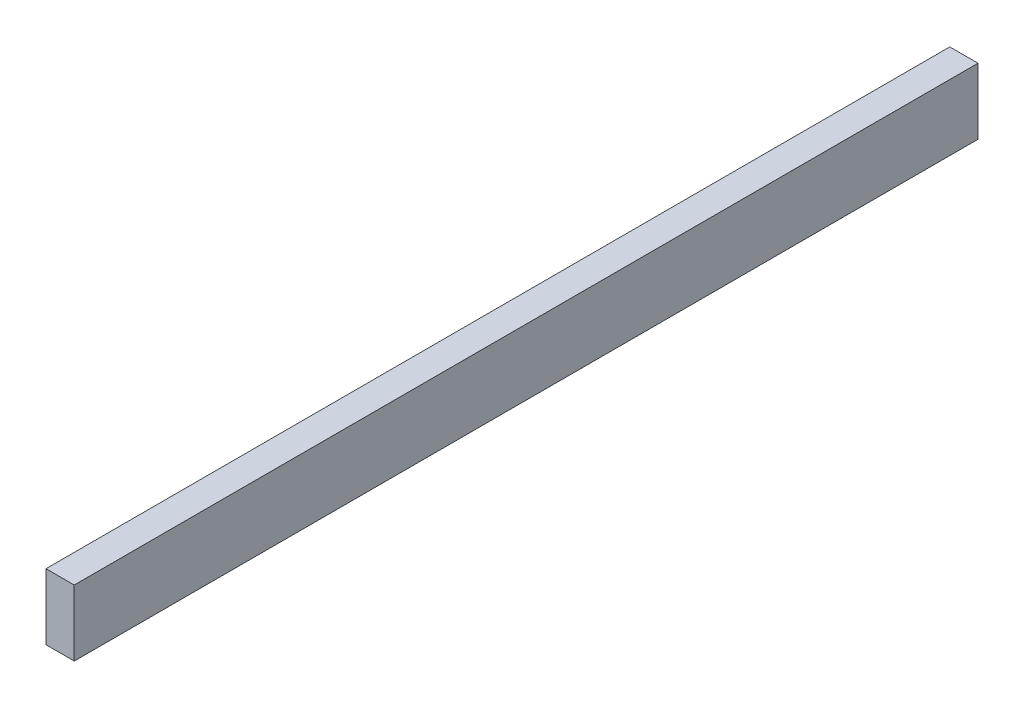
ISO-10303-21;
HEADER;
FILE_DESCRIPTION(('STEP AP214'),'2;1');
FILE_NAME('part.step','',(''),(''),'','','');
FILE_SCHEMA(('AUTOMOTIVE_DESIGN { 1 0 10303 214 1 1 1 1 }'));
ENDSEC;
DATA;
#1=APPLICATION_CONTEXT('core data for automotive mechanical design processes');
#2=APPLICATION_PROTOCOL_DEFINITION('international standard','automotive_design',2000,#1);
#3=PRODUCT_CONTEXT('',#1,'mechanical');
#4=PRODUCT('Part','Part','',(#3));
#5=PRODUCT_RELATED_PRODUCT_CATEGORY('part','',(#4));
#6=PRODUCT_DEFINITION_FORMATION('','',#4);
#7=PRODUCT_DEFINITION_CONTEXT('part definition',#1,'design');
#8=PRODUCT_DEFINITION('design','',#6,#7);
#9=PRODUCT_DEFINITION_SHAPE('','',#8);
#10=(LENGTH_UNIT() NAMED_UNIT(*) SI_UNIT(.MILLI.,.METRE.));
#11=(NAMED_UNIT(*) PLANE_ANGLE_UNIT() SI_UNIT($,.RADIAN.));
#12=(NAMED_UNIT(*) SI_UNIT($,.STERADIAN.) SOLID_ANGLE_UNIT());
#13=UNCERTAINTY_MEASURE_WITH_UNIT(LENGTH_MEASURE(1.E-05),#10,'distance_accuracy_value','');
#14=(GEOMETRIC_REPRESENTATION_CONTEXT(3) GLOBAL_UNCERTAINTY_ASSIGNED_CONTEXT((#13)) GLOBAL_UNIT_ASSIGNED_CONTEXT((#10,
#11,#12)) REPRESENTATION_CONTEXT('',''));
#15=CARTESIAN_POINT('',(0.,0.,0.));
#16=DIRECTION('',(0.,0.,1.));
#17=DIRECTION('',(1.,0.,0.));
#18=AXIS2_PLACEMENT_3D('',#15,#16,#17);
#19=CARTESIAN_POINT('',(19.05,0.,0.));
#20=DIRECTION('',(0.,0.,-1.));
#21=DIRECTION('',(-1.,0.,0.));
#22=AXIS2_PLACEMENT_3D('',#19,#20,#21);
#23=PLANE('',#22);
#24=DIRECTION('',(0.,-1.,0.));
#25=VECTOR('',#24,1.);
#26=CARTESIAN_POINT('',(0.,0.,0.));
#27=LINE('',#26,#25);
#28=CARTESIAN_POINT('',(0.,44.45,0.));
#29=VERTEX_POINT('',#28);
#30=CARTESIAN_POINT('',(0.,0.,0.));
#31=VERTEX_POINT('',#30);
#32=EDGE_CURVE('E96',#29,#31,#27,.T.);
#33=ORIENTED_EDGE('',*,*,#32,.T.);
#34=DIRECTION('',(-1.,0.,0.));
#35=VECTOR('',#34,1.);
#36=CARTESIAN_POINT('',(19.05,0.,0.));
#37=LINE('',#36,#35);
#38=CARTESIAN_POINT('',(19.05,0.,0.));
#39=VERTEX_POINT('',#38);
#40=EDGE_CURVE('E11',#39,#31,#37,.T.);
#41=ORIENTED_EDGE('',*,*,#40,.F.);
#42=DIRECTION('',(0.,-1.,0.));
#43=VECTOR('',#42,1.);
#44=CARTESIAN_POINT('',(19.05,0.,0.));
#45=LINE('',#44,#43);
#46=CARTESIAN_POINT('',(19.05,44.45,0.));
#47=VERTEX_POINT('',#46);
#48=EDGE_CURVE('E84',#47,#39,#45,.T.);
#49=ORIENTED_EDGE('',*,*,#48,.F.);
#50=DIRECTION('',(-1.,0.,0.));
#51=VECTOR('',#50,1.);
#52=CARTESIAN_POINT('',(19.05,44.45,0.));
#53=LINE('',#52,#51);
#54=EDGE_CURVE('E92',#47,#29,#53,.T.);
#55=ORIENTED_EDGE('',*,*,#54,.T.);
#56=EDGE_LOOP('',(#33,#41,#49,#55));
#57=FACE_BOUND('',#56,.T.);
#58=ADVANCED_FACE('F33',(#57),#23,.F.);
#59=CARTESIAN_POINT('',(19.05,0.,0.));
#60=DIRECTION('',(0.,1.,0.));
#61=DIRECTION('',(0.,0.,1.));
#62=AXIS2_PLACEMENT_3D('',#59,#60,#61);
#63=PLANE('',#62);
#64=DIRECTION('',(0.,0.,-1.));
#65=VECTOR('',#64,1.);
#66=CARTESIAN_POINT('',(0.,0.,0.));
#67=LINE('',#66,#65);
#68=CARTESIAN_POINT('',(0.,0.,-609.6));
#69=VERTEX_POINT('',#68);
#70=EDGE_CURVE('E88',#31,#69,#67,.T.);
#71=ORIENTED_EDGE('',*,*,#70,.T.);
#72=DIRECTION('',(-1.,0.,0.));
#73=VECTOR('',#72,1.);
#74=CARTESIAN_POINT('',(19.05,0.,-609.6));
#75=LINE('',#74,#73);
#76=CARTESIAN_POINT('',(19.05,0.,-609.6));
#77=VERTEX_POINT('',#76);
#78=EDGE_CURVE('E41',#77,#69,#75,.T.);
#79=ORIENTED_EDGE('',*,*,#78,.F.);
#80=DIRECTION('',(0.,0.,-1.));
#81=VECTOR('',#80,1.);
#82=CARTESIAN_POINT('',(19.05,0.,0.));
#83=LINE('',#82,#81);
#84=EDGE_CURVE('E79',#39,#77,#83,.T.);
#85=ORIENTED_EDGE('',*,*,#84,.F.);
#86=ORIENTED_EDGE('',*,*,#40,.T.);
#87=EDGE_LOOP('',(#71,#79,#85,#86));
#88=FACE_BOUND('',#87,.T.);
#89=ADVANCED_FACE('F87',(#88),#63,.F.);
#90=CARTESIAN_POINT('',(19.05,0.,-609.6));
#91=DIRECTION('',(0.,0.,1.));
#92=DIRECTION('',(1.,0.,0.));
#93=AXIS2_PLACEMENT_3D('',#90,#91,#92);
#94=PLANE('',#93);
#95=DIRECTION('',(0.,1.,0.));
#96=VECTOR('',#95,1.);
#97=CARTESIAN_POINT('',(0.,0.,-609.6));
#98=LINE('',#97,#96);
#99=CARTESIAN_POINT('',(0.,44.45,-609.6));
#100=VERTEX_POINT('',#99);
#101=EDGE_CURVE('E66',#69,#100,#98,.T.);
#102=ORIENTED_EDGE('',*,*,#101,.T.);
#103=DIRECTION('',(-1.,0.,0.));
#104=VECTOR('',#103,1.);
#105=CARTESIAN_POINT('',(19.05,44.45,-609.6));
#106=LINE('',#105,#104);
#107=CARTESIAN_POINT('',(19.05,44.45,-609.6));
#108=VERTEX_POINT('',#107);
#109=EDGE_CURVE('E89',#108,#100,#106,.T.);
#110=ORIENTED_EDGE('',*,*,#109,.F.);
#111=DIRECTION('',(0.,1.,0.));
#112=VECTOR('',#111,1.);
#113=CARTESIAN_POINT('',(19.05,0.,-609.6));
#114=LINE('',#113,#112);
#115=EDGE_CURVE('E82',#77,#108,#114,.T.);
#116=ORIENTED_EDGE('',*,*,#115,.F.);
#117=ORIENTED_EDGE('',*,*,#78,.T.);
#118=EDGE_LOOP('',(#102,#110,#116,#117));
#119=FACE_BOUND('',#118,.T.);
#120=ADVANCED_FACE('F90',(#119),#94,.F.);
#121=CARTESIAN_POINT('',(19.05,44.45,0.));
#122=DIRECTION('',(0.,-1.,0.));
#123=DIRECTION('',(0.,0.,-1.));
#124=AXIS2_PLACEMENT_3D('',#121,#122,#123);
#125=PLANE('',#124);
#126=DIRECTION('',(0.,0.,1.));
#127=VECTOR('',#126,1.);
#128=CARTESIAN_POINT('',(0.,44.45,0.));
#129=LINE('',#128,#127);
#130=EDGE_CURVE('E72',#100,#29,#129,.T.);
#131=ORIENTED_EDGE('',*,*,#130,.T.);
#132=ORIENTED_EDGE('',*,*,#54,.F.);
#133=DIRECTION('',(0.,0.,1.));
#134=VECTOR('',#133,1.);
#135=CARTESIAN_POINT('',(19.05,44.45,0.));
#136=LINE('',#135,#134);
#137=EDGE_CURVE('E49',#108,#47,#136,.T.);
#138=ORIENTED_EDGE('',*,*,#137,.F.);
#139=ORIENTED_EDGE('',*,*,#109,.T.);
#140=EDGE_LOOP('',(#131,#132,#138,#139));
#141=FACE_BOUND('',#140,.T.);
#142=ADVANCED_FACE('F103',(#141),#125,.F.);
#143=CARTESIAN_POINT('',(19.05,0.,0.));
#144=DIRECTION('',(-1.,0.,0.));
#145=DIRECTION('',(0.,0.,1.));
#146=AXIS2_PLACEMENT_3D('',#143,#144,#145);
#147=PLANE('',#146);
#148=ORIENTED_EDGE('',*,*,#48,.T.);
#149=ORIENTED_EDGE('',*,*,#84,.T.);
#150=ORIENTED_EDGE('',*,*,#115,.T.);
#151=ORIENTED_EDGE('',*,*,#137,.T.);
#152=EDGE_LOOP('',(#148,#149,#150,#151));
#153=FACE_BOUND('',#152,.T.);
#154=ADVANCED_FACE('F80',(#153),#147,.F.);
#155=CARTESIAN_POINT('',(0.,0.,0.));
#156=DIRECTION('',(-1.,0.,0.));
#157=DIRECTION('',(0.,0.,1.));
#158=AXIS2_PLACEMENT_3D('',#155,#156,#157);
#159=PLANE('',#158);
#160=ORIENTED_EDGE('',*,*,#32,.F.);
#161=ORIENTED_EDGE('',*,*,#130,.F.);
#162=ORIENTED_EDGE('',*,*,#101,.F.);
#163=ORIENTED_EDGE('',*,*,#70,.F.);
#164=EDGE_LOOP('',(#160,#161,#162,#163));
#165=FACE_BOUND('',#164,.T.);
#166=ADVANCED_FACE('F106',(#165),#159,.T.);
#167=CLOSED_SHELL('',(#58,#89,#120,#142,#154,#166));
#168=MANIFOLD_SOLID_BREP('B2',#167);
#169=ADVANCED_BREP_SHAPE_REPRESENTATION('',(#18,#168),#14);
#170=SHAPE_DEFINITION_REPRESENTATION(#9,#169);
ENDSEC;
END-ISO-10303-21;
